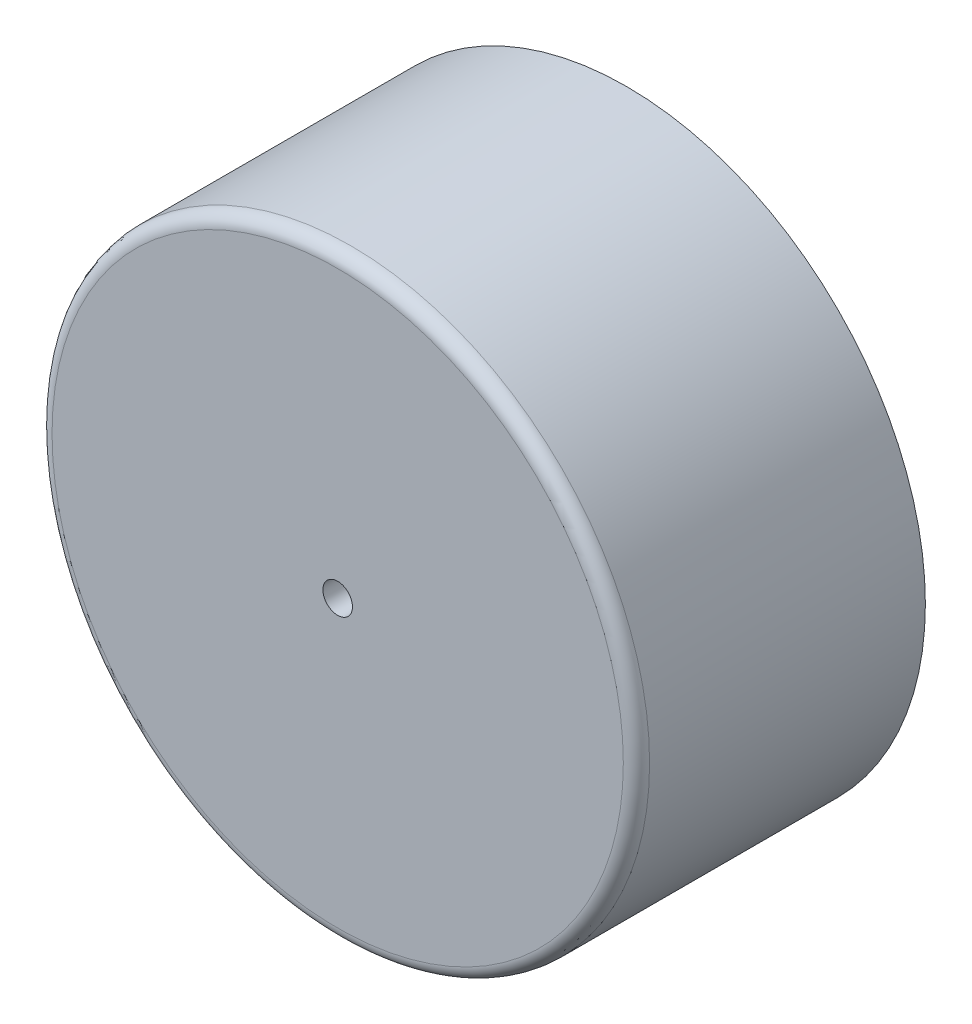
ISO-10303-21;
HEADER;
FILE_DESCRIPTION(('STEP AP214'),'2;1');
FILE_NAME('part.step','',(''),(''),'','','');
FILE_SCHEMA(('AUTOMOTIVE_DESIGN { 1 0 10303 214 1 1 1 1 }'));
ENDSEC;
DATA;
#1=APPLICATION_CONTEXT('core data for automotive mechanical design processes');
#2=APPLICATION_PROTOCOL_DEFINITION('international standard','automotive_design',2000,#1);
#3=PRODUCT_CONTEXT('',#1,'mechanical');
#4=PRODUCT('Part','Part','',(#3));
#5=PRODUCT_RELATED_PRODUCT_CATEGORY('part','',(#4));
#6=PRODUCT_DEFINITION_FORMATION('','',#4);
#7=PRODUCT_DEFINITION_CONTEXT('part definition',#1,'design');
#8=PRODUCT_DEFINITION('design','',#6,#7);
#9=PRODUCT_DEFINITION_SHAPE('','',#8);
#10=(LENGTH_UNIT() NAMED_UNIT(*) SI_UNIT(.MILLI.,.METRE.));
#11=(NAMED_UNIT(*) PLANE_ANGLE_UNIT() SI_UNIT($,.RADIAN.));
#12=(NAMED_UNIT(*) SI_UNIT($,.STERADIAN.) SOLID_ANGLE_UNIT());
#13=UNCERTAINTY_MEASURE_WITH_UNIT(LENGTH_MEASURE(1.E-05),#10,'distance_accuracy_value','');
#14=(GEOMETRIC_REPRESENTATION_CONTEXT(3) GLOBAL_UNCERTAINTY_ASSIGNED_CONTEXT((#13)) GLOBAL_UNIT_ASSIGNED_CONTEXT((#10,
#11,#12)) REPRESENTATION_CONTEXT('',''));
#15=CARTESIAN_POINT('',(0.,0.,0.));
#16=DIRECTION('',(0.,0.,1.));
#17=DIRECTION('',(1.,0.,0.));
#18=AXIS2_PLACEMENT_3D('',#15,#16,#17);
#19=CARTESIAN_POINT('',(0.,0.,2.));
#20=DIRECTION('',(0.,0.,-1.));
#21=DIRECTION('',(-1.,0.,0.));
#22=AXIS2_PLACEMENT_3D('',#19,#20,#21);
#23=CYLINDRICAL_SURFACE('',#22,22.75);
#24=CARTESIAN_POINT('',(0.,0.,1.));
#25=DIRECTION('',(0.,0.,1.));
#26=DIRECTION('',(1.,0.,0.));
#27=AXIS2_PLACEMENT_3D('',#24,#25,#26);
#28=CIRCLE('',#27,22.75);
#29=CARTESIAN_POINT('',(22.75,0.,1.));
#30=VERTEX_POINT('',#29);
#31=EDGE_CURVE('E10',#30,#30,#28,.F.);
#32=ORIENTED_EDGE('',*,*,#31,.T.);
#33=EDGE_LOOP('',(#32));
#34=FACE_BOUND('',#33,.T.);
#35=CARTESIAN_POINT('',(0.,0.,-20.));
#36=DIRECTION('',(0.,0.,-1.));
#37=DIRECTION('',(-1.,0.,0.));
#38=AXIS2_PLACEMENT_3D('',#35,#36,#37);
#39=CIRCLE('',#38,22.75);
#40=CARTESIAN_POINT('',(-22.75,0.,-20.));
#41=VERTEX_POINT('',#40);
#42=EDGE_CURVE('E43',#41,#41,#39,.T.);
#43=ORIENTED_EDGE('',*,*,#42,.F.);
#44=EDGE_LOOP('',(#43));
#45=FACE_BOUND('',#44,.T.);
#46=ADVANCED_FACE('F31',(#34,#45),#23,.T.);
#47=CARTESIAN_POINT('',(0.,0.,2.));
#48=DIRECTION('',(0.,0.,1.));
#49=DIRECTION('',(1.,0.,0.));
#50=AXIS2_PLACEMENT_3D('',#47,#48,#49);
#51=PLANE('',#50);
#52=CARTESIAN_POINT('',(0.,0.,2.));
#53=DIRECTION('',(0.,0.,1.));
#54=DIRECTION('',(1.,0.,0.));
#55=AXIS2_PLACEMENT_3D('',#52,#53,#54);
#56=CIRCLE('',#55,1.125);
#57=CARTESIAN_POINT('',(1.125,0.,2.));
#58=VERTEX_POINT('',#57);
#59=EDGE_CURVE('E54',#58,#58,#56,.T.);
#60=ORIENTED_EDGE('',*,*,#59,.F.);
#61=EDGE_LOOP('',(#60));
#62=FACE_BOUND('',#61,.T.);
#63=CARTESIAN_POINT('',(0.,0.,2.));
#64=DIRECTION('',(0.,0.,1.));
#65=DIRECTION('',(1.,0.,0.));
#66=AXIS2_PLACEMENT_3D('',#63,#64,#65);
#67=CIRCLE('',#66,21.75);
#68=CARTESIAN_POINT('',(21.75,0.,2.));
#69=VERTEX_POINT('',#68);
#70=EDGE_CURVE('E39',#69,#69,#67,.T.);
#71=ORIENTED_EDGE('',*,*,#70,.T.);
#72=EDGE_LOOP('',(#71));
#73=FACE_BOUND('',#72,.T.);
#74=ADVANCED_FACE('F73',(#62,#73),#51,.T.);
#75=CARTESIAN_POINT('',(0.,0.,-20.));
#76=DIRECTION('',(0.,0.,-1.));
#77=DIRECTION('',(-1.,0.,0.));
#78=AXIS2_PLACEMENT_3D('',#75,#76,#77);
#79=PLANE('',#78);
#80=ORIENTED_EDGE('',*,*,#42,.T.);
#81=EDGE_LOOP('',(#80));
#82=FACE_BOUND('',#81,.T.);
#83=CARTESIAN_POINT('',(0.,0.,-20.));
#84=DIRECTION('',(0.,0.,-1.));
#85=DIRECTION('',(-1.,0.,0.));
#86=AXIS2_PLACEMENT_3D('',#83,#84,#85);
#87=CIRCLE('',#86,20.75);
#88=CARTESIAN_POINT('',(-20.75,0.,-20.));
#89=VERTEX_POINT('',#88);
#90=EDGE_CURVE('E48',#89,#89,#87,.T.);
#91=ORIENTED_EDGE('',*,*,#90,.F.);
#92=EDGE_LOOP('',(#91));
#93=FACE_BOUND('',#92,.T.);
#94=ADVANCED_FACE('F77',(#82,#93),#79,.T.);
#95=CARTESIAN_POINT('',(0.,0.,-20.));
#96=DIRECTION('',(0.,0.,1.));
#97=DIRECTION('',(1.,0.,0.));
#98=AXIS2_PLACEMENT_3D('',#95,#96,#97);
#99=CYLINDRICAL_SURFACE('',#98,20.75);
#100=ORIENTED_EDGE('',*,*,#90,.T.);
#101=EDGE_LOOP('',(#100));
#102=FACE_BOUND('',#101,.T.);
#103=CARTESIAN_POINT('',(0.,0.,0.));
#104=DIRECTION('',(0.,0.,-1.));
#105=DIRECTION('',(-1.,0.,0.));
#106=AXIS2_PLACEMENT_3D('',#103,#104,#105);
#107=CIRCLE('',#106,20.75);
#108=CARTESIAN_POINT('',(-20.75,0.,0.));
#109=VERTEX_POINT('',#108);
#110=EDGE_CURVE('E49',#109,#109,#107,.T.);
#111=ORIENTED_EDGE('',*,*,#110,.F.);
#112=EDGE_LOOP('',(#111));
#113=FACE_BOUND('',#112,.T.);
#114=ADVANCED_FACE('F83',(#102,#113),#99,.F.);
#115=CARTESIAN_POINT('',(0.,0.,0.));
#116=DIRECTION('',(0.,0.,1.));
#117=DIRECTION('',(1.,0.,0.));
#118=AXIS2_PLACEMENT_3D('',#115,#116,#117);
#119=PLANE('',#118);
#120=CARTESIAN_POINT('',(0.,0.,0.));
#121=DIRECTION('',(0.,0.,1.));
#122=DIRECTION('',(1.,0.,0.));
#123=AXIS2_PLACEMENT_3D('',#120,#121,#122);
#124=CIRCLE('',#123,1.125);
#125=CARTESIAN_POINT('',(1.125,0.,0.));
#126=VERTEX_POINT('',#125);
#127=EDGE_CURVE('E35',#126,#126,#124,.T.);
#128=ORIENTED_EDGE('',*,*,#127,.T.);
#129=EDGE_LOOP('',(#128));
#130=FACE_BOUND('',#129,.T.);
#131=ORIENTED_EDGE('',*,*,#110,.T.);
#132=EDGE_LOOP('',(#131));
#133=FACE_BOUND('',#132,.T.);
#134=ADVANCED_FACE('F61',(#130,#133),#119,.F.);
#135=CARTESIAN_POINT('',(0.,0.,1.));
#136=DIRECTION('',(0.,0.,1.));
#137=DIRECTION('',(1.,0.,0.));
#138=AXIS2_PLACEMENT_3D('',#135,#136,#137);
#139=TOROIDAL_SURFACE('',#138,21.75,1.);
#140=ORIENTED_EDGE('',*,*,#31,.F.);
#141=EDGE_LOOP('',(#140));
#142=FACE_BOUND('',#141,.T.);
#143=ORIENTED_EDGE('',*,*,#70,.F.);
#144=EDGE_LOOP('',(#143));
#145=FACE_BOUND('',#144,.T.);
#146=ADVANCED_FACE('F33',(#142,#145),#139,.T.);
#147=CARTESIAN_POINT('',(0.,0.,-18.));
#148=DIRECTION('',(0.,0.,1.));
#149=DIRECTION('',(1.,0.,0.));
#150=AXIS2_PLACEMENT_3D('',#147,#148,#149);
#151=CYLINDRICAL_SURFACE('',#150,1.125);
#152=ORIENTED_EDGE('',*,*,#59,.T.);
#153=EDGE_LOOP('',(#152));
#154=FACE_BOUND('',#153,.T.);
#155=ORIENTED_EDGE('',*,*,#127,.F.);
#156=EDGE_LOOP('',(#155));
#157=FACE_BOUND('',#156,.T.);
#158=ADVANCED_FACE('F64',(#154,#157),#151,.F.);
#159=CLOSED_SHELL('',(#46,#74,#94,#114,#134,#146,#158));
#160=MANIFOLD_SOLID_BREP('B2',#159);
#161=ADVANCED_BREP_SHAPE_REPRESENTATION('',(#18,#160),#14);
#162=SHAPE_DEFINITION_REPRESENTATION(#9,#161);
ENDSEC;
END-ISO-10303-21;
